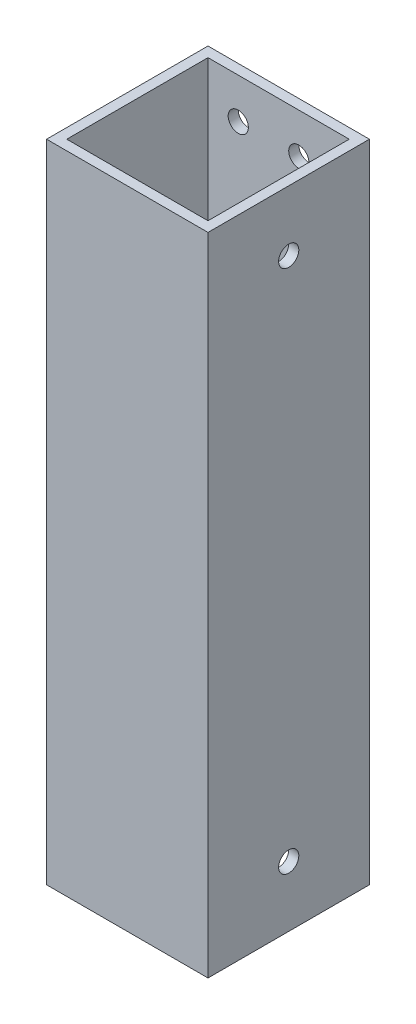
ISO-10303-21;
HEADER;
FILE_DESCRIPTION(('STEP AP214'),'2;1');
FILE_NAME('part.step','',(''),(''),'','','');
FILE_SCHEMA(('AUTOMOTIVE_DESIGN { 1 0 10303 214 1 1 1 1 }'));
ENDSEC;
DATA;
#1=APPLICATION_CONTEXT('core data for automotive mechanical design processes');
#2=APPLICATION_PROTOCOL_DEFINITION('international standard','automotive_design',2000,#1);
#3=PRODUCT_CONTEXT('',#1,'mechanical');
#4=PRODUCT('Part','Part','',(#3));
#5=PRODUCT_RELATED_PRODUCT_CATEGORY('part','',(#4));
#6=PRODUCT_DEFINITION_FORMATION('','',#4);
#7=PRODUCT_DEFINITION_CONTEXT('part definition',#1,'design');
#8=PRODUCT_DEFINITION('design','',#6,#7);
#9=PRODUCT_DEFINITION_SHAPE('','',#8);
#10=(LENGTH_UNIT() NAMED_UNIT(*) SI_UNIT(.MILLI.,.METRE.));
#11=(NAMED_UNIT(*) PLANE_ANGLE_UNIT() SI_UNIT($,.RADIAN.));
#12=(NAMED_UNIT(*) SI_UNIT($,.STERADIAN.) SOLID_ANGLE_UNIT());
#13=UNCERTAINTY_MEASURE_WITH_UNIT(LENGTH_MEASURE(1.E-05),#10,'distance_accuracy_value','');
#14=(GEOMETRIC_REPRESENTATION_CONTEXT(3) GLOBAL_UNCERTAINTY_ASSIGNED_CONTEXT((#13)) GLOBAL_UNIT_ASSIGNED_CONTEXT((#10,
#11,#12)) REPRESENTATION_CONTEXT('',''));
#15=CARTESIAN_POINT('',(0.,0.,0.));
#16=DIRECTION('',(0.,0.,1.));
#17=DIRECTION('',(1.,0.,0.));
#18=AXIS2_PLACEMENT_3D('',#15,#16,#17);
#19=CARTESIAN_POINT('',(0.,203.2,0.));
#20=DIRECTION('',(0.,-1.,0.));
#21=DIRECTION('',(0.,0.,-1.));
#22=AXIS2_PLACEMENT_3D('',#19,#20,#21);
#23=PLANE('',#22);
#24=DIRECTION('',(0.,0.,1.));
#25=VECTOR('',#24,1.);
#26=CARTESIAN_POINT('',(0.,203.2,0.));
#27=LINE('',#26,#25);
#28=CARTESIAN_POINT('',(0.,203.2,-50.8));
#29=VERTEX_POINT('',#28);
#30=CARTESIAN_POINT('',(0.,203.2,0.));
#31=VERTEX_POINT('',#30);
#32=EDGE_CURVE('E138',#29,#31,#27,.T.);
#33=ORIENTED_EDGE('',*,*,#32,.T.);
#34=DIRECTION('',(1.,0.,0.));
#35=VECTOR('',#34,1.);
#36=CARTESIAN_POINT('',(0.,203.2,0.));
#37=LINE('',#36,#35);
#38=CARTESIAN_POINT('',(50.8,203.2,0.));
#39=VERTEX_POINT('',#38);
#40=EDGE_CURVE('E141',#31,#39,#37,.T.);
#41=ORIENTED_EDGE('',*,*,#40,.T.);
#42=DIRECTION('',(0.,0.,-1.));
#43=VECTOR('',#42,1.);
#44=CARTESIAN_POINT('',(50.8,203.2,0.));
#45=LINE('',#44,#43);
#46=CARTESIAN_POINT('',(50.8,203.2,-50.8));
#47=VERTEX_POINT('',#46);
#48=EDGE_CURVE('E144',#39,#47,#45,.T.);
#49=ORIENTED_EDGE('',*,*,#48,.T.);
#50=DIRECTION('',(-1.,0.,0.));
#51=VECTOR('',#50,1.);
#52=CARTESIAN_POINT('',(0.,203.2,-50.8));
#53=LINE('',#52,#51);
#54=EDGE_CURVE('E146',#47,#29,#53,.T.);
#55=ORIENTED_EDGE('',*,*,#54,.T.);
#56=EDGE_LOOP('',(#33,#41,#49,#55));
#57=FACE_BOUND('',#56,.T.);
#58=DIRECTION('',(0.,0.,1.));
#59=VECTOR('',#58,1.);
#60=CARTESIAN_POINT('',(3.175,203.2,-3.175));
#61=LINE('',#60,#59);
#62=CARTESIAN_POINT('',(3.175,203.2,-47.625));
#63=VERTEX_POINT('',#62);
#64=CARTESIAN_POINT('',(3.175,203.2,-3.175));
#65=VERTEX_POINT('',#64);
#66=EDGE_CURVE('E100',#63,#65,#61,.T.);
#67=ORIENTED_EDGE('',*,*,#66,.F.);
#68=DIRECTION('',(-1.,0.,0.));
#69=VECTOR('',#68,1.);
#70=CARTESIAN_POINT('',(3.175,203.2,-47.625));
#71=LINE('',#70,#69);
#72=CARTESIAN_POINT('',(47.625,203.2,-47.625));
#73=VERTEX_POINT('',#72);
#74=EDGE_CURVE('E122',#73,#63,#71,.T.);
#75=ORIENTED_EDGE('',*,*,#74,.F.);
#76=DIRECTION('',(0.,0.,-1.));
#77=VECTOR('',#76,1.);
#78=CARTESIAN_POINT('',(47.625,203.2,-3.175));
#79=LINE('',#78,#77);
#80=CARTESIAN_POINT('',(47.625,203.2,-3.175));
#81=VERTEX_POINT('',#80);
#82=EDGE_CURVE('E120',#81,#73,#79,.T.);
#83=ORIENTED_EDGE('',*,*,#82,.F.);
#84=DIRECTION('',(1.,0.,0.));
#85=VECTOR('',#84,1.);
#86=CARTESIAN_POINT('',(3.175,203.2,-3.175));
#87=LINE('',#86,#85);
#88=EDGE_CURVE('E108',#65,#81,#87,.T.);
#89=ORIENTED_EDGE('',*,*,#88,.F.);
#90=EDGE_LOOP('',(#67,#75,#83,#89));
#91=FACE_BOUND('',#90,.T.);
#92=ADVANCED_FACE('F33',(#57,#91),#23,.F.);
#93=CARTESIAN_POINT('',(0.,0.,0.));
#94=DIRECTION('',(0.,-1.,0.));
#95=DIRECTION('',(0.,0.,-1.));
#96=AXIS2_PLACEMENT_3D('',#93,#94,#95);
#97=PLANE('',#96);
#98=DIRECTION('',(0.,0.,1.));
#99=VECTOR('',#98,1.);
#100=CARTESIAN_POINT('',(0.,0.,0.));
#101=LINE('',#100,#99);
#102=CARTESIAN_POINT('',(0.,0.,-50.8));
#103=VERTEX_POINT('',#102);
#104=CARTESIAN_POINT('',(0.,0.,0.));
#105=VERTEX_POINT('',#104);
#106=EDGE_CURVE('E116',#103,#105,#101,.T.);
#107=ORIENTED_EDGE('',*,*,#106,.F.);
#108=DIRECTION('',(-1.,0.,0.));
#109=VECTOR('',#108,1.);
#110=CARTESIAN_POINT('',(0.,0.,-50.8));
#111=LINE('',#110,#109);
#112=CARTESIAN_POINT('',(50.8,0.,-50.8));
#113=VERTEX_POINT('',#112);
#114=EDGE_CURVE('E142',#113,#103,#111,.T.);
#115=ORIENTED_EDGE('',*,*,#114,.F.);
#116=DIRECTION('',(0.,0.,-1.));
#117=VECTOR('',#116,1.);
#118=CARTESIAN_POINT('',(50.8,0.,0.));
#119=LINE('',#118,#117);
#120=CARTESIAN_POINT('',(50.8,0.,0.));
#121=VERTEX_POINT('',#120);
#122=EDGE_CURVE('E153',#121,#113,#119,.T.);
#123=ORIENTED_EDGE('',*,*,#122,.F.);
#124=DIRECTION('',(1.,0.,0.));
#125=VECTOR('',#124,1.);
#126=CARTESIAN_POINT('',(0.,0.,0.));
#127=LINE('',#126,#125);
#128=EDGE_CURVE('E151',#105,#121,#127,.T.);
#129=ORIENTED_EDGE('',*,*,#128,.F.);
#130=EDGE_LOOP('',(#107,#115,#123,#129));
#131=FACE_BOUND('',#130,.T.);
#132=DIRECTION('',(-1.,0.,0.));
#133=VECTOR('',#132,1.);
#134=CARTESIAN_POINT('',(3.175,0.,-47.625));
#135=LINE('',#134,#133);
#136=CARTESIAN_POINT('',(47.625,0.,-47.625));
#137=VERTEX_POINT('',#136);
#138=CARTESIAN_POINT('',(3.175,0.,-47.625));
#139=VERTEX_POINT('',#138);
#140=EDGE_CURVE('E109',#137,#139,#135,.T.);
#141=ORIENTED_EDGE('',*,*,#140,.T.);
#142=DIRECTION('',(0.,0.,1.));
#143=VECTOR('',#142,1.);
#144=CARTESIAN_POINT('',(3.175,0.,-3.175));
#145=LINE('',#144,#143);
#146=CARTESIAN_POINT('',(3.175,0.,-3.175));
#147=VERTEX_POINT('',#146);
#148=EDGE_CURVE('E58',#139,#147,#145,.T.);
#149=ORIENTED_EDGE('',*,*,#148,.T.);
#150=DIRECTION('',(1.,0.,0.));
#151=VECTOR('',#150,1.);
#152=CARTESIAN_POINT('',(3.175,0.,-3.175));
#153=LINE('',#152,#151);
#154=CARTESIAN_POINT('',(47.625,0.,-3.175));
#155=VERTEX_POINT('',#154);
#156=EDGE_CURVE('E115',#147,#155,#153,.T.);
#157=ORIENTED_EDGE('',*,*,#156,.T.);
#158=DIRECTION('',(0.,0.,-1.));
#159=VECTOR('',#158,1.);
#160=CARTESIAN_POINT('',(47.625,0.,-3.175));
#161=LINE('',#160,#159);
#162=EDGE_CURVE('E130',#155,#137,#161,.T.);
#163=ORIENTED_EDGE('',*,*,#162,.T.);
#164=EDGE_LOOP('',(#141,#149,#157,#163));
#165=FACE_BOUND('',#164,.T.);
#166=ADVANCED_FACE('F216',(#131,#165),#97,.T.);
#167=CARTESIAN_POINT('',(0.,203.2,0.));
#168=DIRECTION('',(1.,0.,0.));
#169=DIRECTION('',(0.,0.,-1.));
#170=AXIS2_PLACEMENT_3D('',#167,#168,#169);
#171=PLANE('',#170);
#172=ORIENTED_EDGE('',*,*,#106,.T.);
#173=DIRECTION('',(0.,-1.,0.));
#174=VECTOR('',#173,1.);
#175=CARTESIAN_POINT('',(0.,203.2,0.));
#176=LINE('',#175,#174);
#177=EDGE_CURVE('E11',#31,#105,#176,.T.);
#178=ORIENTED_EDGE('',*,*,#177,.F.);
#179=ORIENTED_EDGE('',*,*,#32,.F.);
#180=DIRECTION('',(0.,-1.,0.));
#181=VECTOR('',#180,1.);
#182=CARTESIAN_POINT('',(0.,203.2,-50.8));
#183=LINE('',#182,#181);
#184=EDGE_CURVE('E148',#29,#103,#183,.T.);
#185=ORIENTED_EDGE('',*,*,#184,.T.);
#186=EDGE_LOOP('',(#172,#178,#179,#185));
#187=FACE_BOUND('',#186,.T.);
#188=ADVANCED_FACE('F35',(#187),#171,.F.);
#189=CARTESIAN_POINT('',(0.,203.2,0.));
#190=DIRECTION('',(0.,0.,-1.));
#191=DIRECTION('',(-1.,0.,0.));
#192=AXIS2_PLACEMENT_3D('',#189,#190,#191);
#193=PLANE('',#192);
#194=ORIENTED_EDGE('',*,*,#128,.T.);
#195=DIRECTION('',(0.,-1.,0.));
#196=VECTOR('',#195,1.);
#197=CARTESIAN_POINT('',(50.8,203.2,0.));
#198=LINE('',#197,#196);
#199=EDGE_CURVE('E42',#39,#121,#198,.T.);
#200=ORIENTED_EDGE('',*,*,#199,.F.);
#201=ORIENTED_EDGE('',*,*,#40,.F.);
#202=ORIENTED_EDGE('',*,*,#177,.T.);
#203=EDGE_LOOP('',(#194,#200,#201,#202));
#204=FACE_BOUND('',#203,.T.);
#205=ADVANCED_FACE('F220',(#204),#193,.F.);
#206=CARTESIAN_POINT('',(50.8,203.2,0.));
#207=DIRECTION('',(-1.,0.,0.));
#208=DIRECTION('',(0.,0.,1.));
#209=AXIS2_PLACEMENT_3D('',#206,#207,#208);
#210=PLANE('',#209);
#211=CARTESIAN_POINT('',(50.8,19.05,-25.4));
#212=DIRECTION('',(1.,0.,0.));
#213=DIRECTION('',(0.,0.,-1.));
#214=AXIS2_PLACEMENT_3D('',#211,#212,#213);
#215=CIRCLE('',#214,3.175);
#216=CARTESIAN_POINT('',(50.8,19.05,-28.575));
#217=VERTEX_POINT('',#216);
#218=EDGE_CURVE('E189',#217,#217,#215,.T.);
#219=ORIENTED_EDGE('',*,*,#218,.F.);
#220=EDGE_LOOP('',(#219));
#221=FACE_BOUND('',#220,.T.);
#222=CARTESIAN_POINT('',(50.8,184.15,-25.4));
#223=DIRECTION('',(1.,0.,0.));
#224=DIRECTION('',(0.,0.,-1.));
#225=AXIS2_PLACEMENT_3D('',#222,#223,#224);
#226=CIRCLE('',#225,3.175);
#227=CARTESIAN_POINT('',(50.8,184.15,-28.575));
#228=VERTEX_POINT('',#227);
#229=EDGE_CURVE('E179',#228,#228,#226,.T.);
#230=ORIENTED_EDGE('',*,*,#229,.F.);
#231=EDGE_LOOP('',(#230));
#232=FACE_BOUND('',#231,.T.);
#233=ORIENTED_EDGE('',*,*,#122,.T.);
#234=DIRECTION('',(0.,-1.,0.));
#235=VECTOR('',#234,1.);
#236=CARTESIAN_POINT('',(50.8,203.2,-50.8));
#237=LINE('',#236,#235);
#238=EDGE_CURVE('E158',#47,#113,#237,.T.);
#239=ORIENTED_EDGE('',*,*,#238,.F.);
#240=ORIENTED_EDGE('',*,*,#48,.F.);
#241=ORIENTED_EDGE('',*,*,#199,.T.);
#242=EDGE_LOOP('',(#233,#239,#240,#241));
#243=FACE_BOUND('',#242,.T.);
#244=ADVANCED_FACE('F203',(#221,#232,#243),#210,.F.);
#245=CARTESIAN_POINT('',(0.,203.2,-50.8));
#246=DIRECTION('',(0.,0.,1.));
#247=DIRECTION('',(1.,0.,0.));
#248=AXIS2_PLACEMENT_3D('',#245,#246,#247);
#249=PLANE('',#248);
#250=CARTESIAN_POINT('',(12.7,12.7,-50.8));
#251=DIRECTION('',(0.,0.,-1.));
#252=DIRECTION('',(-1.,0.,0.));
#253=AXIS2_PLACEMENT_3D('',#250,#251,#252);
#254=CIRCLE('',#253,3.175);
#255=CARTESIAN_POINT('',(9.52500000000001,12.7,-50.8));
#256=VERTEX_POINT('',#255);
#257=EDGE_CURVE('E176',#256,#256,#254,.T.);
#258=ORIENTED_EDGE('',*,*,#257,.F.);
#259=EDGE_LOOP('',(#258));
#260=FACE_BOUND('',#259,.T.);
#261=CARTESIAN_POINT('',(31.75,12.7,-50.8));
#262=DIRECTION('',(0.,0.,-1.));
#263=DIRECTION('',(-1.,0.,0.));
#264=AXIS2_PLACEMENT_3D('',#261,#262,#263);
#265=CIRCLE('',#264,3.175);
#266=CARTESIAN_POINT('',(28.575,12.7,-50.8));
#267=VERTEX_POINT('',#266);
#268=EDGE_CURVE('E173',#267,#267,#265,.T.);
#269=ORIENTED_EDGE('',*,*,#268,.F.);
#270=EDGE_LOOP('',(#269));
#271=FACE_BOUND('',#270,.T.);
#272=CARTESIAN_POINT('',(31.75,190.5,-50.8));
#273=DIRECTION('',(0.,0.,-1.));
#274=DIRECTION('',(-1.,0.,0.));
#275=AXIS2_PLACEMENT_3D('',#272,#273,#274);
#276=CIRCLE('',#275,3.175);
#277=CARTESIAN_POINT('',(28.575,190.5,-50.8));
#278=VERTEX_POINT('',#277);
#279=EDGE_CURVE('E169',#278,#278,#276,.T.);
#280=ORIENTED_EDGE('',*,*,#279,.F.);
#281=EDGE_LOOP('',(#280));
#282=FACE_BOUND('',#281,.T.);
#283=CARTESIAN_POINT('',(12.7,190.5,-50.8));
#284=DIRECTION('',(0.,0.,-1.));
#285=DIRECTION('',(-1.,0.,0.));
#286=AXIS2_PLACEMENT_3D('',#283,#284,#285);
#287=CIRCLE('',#286,3.175);
#288=CARTESIAN_POINT('',(9.525,190.5,-50.8));
#289=VERTEX_POINT('',#288);
#290=EDGE_CURVE('E165',#289,#289,#287,.T.);
#291=ORIENTED_EDGE('',*,*,#290,.F.);
#292=EDGE_LOOP('',(#291));
#293=FACE_BOUND('',#292,.T.);
#294=ORIENTED_EDGE('',*,*,#114,.T.);
#295=ORIENTED_EDGE('',*,*,#184,.F.);
#296=ORIENTED_EDGE('',*,*,#54,.F.);
#297=ORIENTED_EDGE('',*,*,#238,.T.);
#298=EDGE_LOOP('',(#294,#295,#296,#297));
#299=FACE_BOUND('',#298,.T.);
#300=ADVANCED_FACE('F200',(#260,#271,#282,#293,#299),#249,.F.);
#301=CARTESIAN_POINT('',(3.175,203.2,-3.175));
#302=DIRECTION('',(1.,0.,0.));
#303=DIRECTION('',(0.,0.,-1.));
#304=AXIS2_PLACEMENT_3D('',#301,#302,#303);
#305=PLANE('',#304);
#306=ORIENTED_EDGE('',*,*,#148,.F.);
#307=DIRECTION('',(0.,-1.,0.));
#308=VECTOR('',#307,1.);
#309=CARTESIAN_POINT('',(3.175,203.2,-47.625));
#310=LINE('',#309,#308);
#311=EDGE_CURVE('E104',#63,#139,#310,.T.);
#312=ORIENTED_EDGE('',*,*,#311,.F.);
#313=ORIENTED_EDGE('',*,*,#66,.T.);
#314=DIRECTION('',(0.,-1.,0.));
#315=VECTOR('',#314,1.);
#316=CARTESIAN_POINT('',(3.175,203.2,-3.175));
#317=LINE('',#316,#315);
#318=EDGE_CURVE('E103',#65,#147,#317,.T.);
#319=ORIENTED_EDGE('',*,*,#318,.T.);
#320=EDGE_LOOP('',(#306,#312,#313,#319));
#321=FACE_BOUND('',#320,.T.);
#322=ADVANCED_FACE('F102',(#321),#305,.T.);
#323=CARTESIAN_POINT('',(3.175,203.2,-3.175));
#324=DIRECTION('',(0.,0.,-1.));
#325=DIRECTION('',(-1.,0.,0.));
#326=AXIS2_PLACEMENT_3D('',#323,#324,#325);
#327=PLANE('',#326);
#328=ORIENTED_EDGE('',*,*,#156,.F.);
#329=ORIENTED_EDGE('',*,*,#318,.F.);
#330=ORIENTED_EDGE('',*,*,#88,.T.);
#331=DIRECTION('',(0.,-1.,0.));
#332=VECTOR('',#331,1.);
#333=CARTESIAN_POINT('',(47.625,203.2,-3.175));
#334=LINE('',#333,#332);
#335=EDGE_CURVE('E117',#81,#155,#334,.T.);
#336=ORIENTED_EDGE('',*,*,#335,.T.);
#337=EDGE_LOOP('',(#328,#329,#330,#336));
#338=FACE_BOUND('',#337,.T.);
#339=ADVANCED_FACE('F112',(#338),#327,.T.);
#340=CARTESIAN_POINT('',(47.625,203.2,-3.175));
#341=DIRECTION('',(-1.,0.,0.));
#342=DIRECTION('',(0.,0.,1.));
#343=AXIS2_PLACEMENT_3D('',#340,#341,#342);
#344=PLANE('',#343);
#345=CARTESIAN_POINT('',(47.625,19.05,-25.4));
#346=DIRECTION('',(-1.,0.,0.));
#347=DIRECTION('',(0.,0.,1.));
#348=AXIS2_PLACEMENT_3D('',#345,#346,#347);
#349=CIRCLE('',#348,3.175);
#350=CARTESIAN_POINT('',(47.625,19.05,-22.225));
#351=VERTEX_POINT('',#350);
#352=EDGE_CURVE('E37',#351,#351,#349,.T.);
#353=ORIENTED_EDGE('',*,*,#352,.F.);
#354=EDGE_LOOP('',(#353));
#355=FACE_BOUND('',#354,.T.);
#356=CARTESIAN_POINT('',(47.625,184.15,-25.4));
#357=DIRECTION('',(-1.,0.,0.));
#358=DIRECTION('',(0.,0.,1.));
#359=AXIS2_PLACEMENT_3D('',#356,#357,#358);
#360=CIRCLE('',#359,3.175);
#361=CARTESIAN_POINT('',(47.625,184.15,-22.225));
#362=VERTEX_POINT('',#361);
#363=EDGE_CURVE('E177',#362,#362,#360,.T.);
#364=ORIENTED_EDGE('',*,*,#363,.F.);
#365=EDGE_LOOP('',(#364));
#366=FACE_BOUND('',#365,.T.);
#367=ORIENTED_EDGE('',*,*,#162,.F.);
#368=ORIENTED_EDGE('',*,*,#335,.F.);
#369=ORIENTED_EDGE('',*,*,#82,.T.);
#370=DIRECTION('',(0.,-1.,0.));
#371=VECTOR('',#370,1.);
#372=CARTESIAN_POINT('',(47.625,203.2,-47.625));
#373=LINE('',#372,#371);
#374=EDGE_CURVE('E50',#73,#137,#373,.T.);
#375=ORIENTED_EDGE('',*,*,#374,.T.);
#376=EDGE_LOOP('',(#367,#368,#369,#375));
#377=FACE_BOUND('',#376,.T.);
#378=ADVANCED_FACE('F245',(#355,#366,#377),#344,.T.);
#379=CARTESIAN_POINT('',(3.175,203.2,-47.625));
#380=DIRECTION('',(0.,0.,1.));
#381=DIRECTION('',(1.,0.,0.));
#382=AXIS2_PLACEMENT_3D('',#379,#380,#381);
#383=PLANE('',#382);
#384=CARTESIAN_POINT('',(12.7,12.7,-47.625));
#385=DIRECTION('',(0.,0.,1.));
#386=DIRECTION('',(1.,0.,0.));
#387=AXIS2_PLACEMENT_3D('',#384,#385,#386);
#388=CIRCLE('',#387,3.175);
#389=CARTESIAN_POINT('',(15.875,12.7,-47.625));
#390=VERTEX_POINT('',#389);
#391=EDGE_CURVE('E174',#390,#390,#388,.T.);
#392=ORIENTED_EDGE('',*,*,#391,.F.);
#393=EDGE_LOOP('',(#392));
#394=FACE_BOUND('',#393,.T.);
#395=CARTESIAN_POINT('',(31.75,12.7,-47.625));
#396=DIRECTION('',(0.,0.,1.));
#397=DIRECTION('',(1.,0.,0.));
#398=AXIS2_PLACEMENT_3D('',#395,#396,#397);
#399=CIRCLE('',#398,3.175);
#400=CARTESIAN_POINT('',(34.925,12.7,-47.625));
#401=VERTEX_POINT('',#400);
#402=EDGE_CURVE('E170',#401,#401,#399,.T.);
#403=ORIENTED_EDGE('',*,*,#402,.F.);
#404=EDGE_LOOP('',(#403));
#405=FACE_BOUND('',#404,.T.);
#406=CARTESIAN_POINT('',(31.75,190.5,-47.625));
#407=DIRECTION('',(0.,0.,1.));
#408=DIRECTION('',(1.,0.,0.));
#409=AXIS2_PLACEMENT_3D('',#406,#407,#408);
#410=CIRCLE('',#409,3.175);
#411=CARTESIAN_POINT('',(34.925,190.5,-47.625));
#412=VERTEX_POINT('',#411);
#413=EDGE_CURVE('E166',#412,#412,#410,.T.);
#414=ORIENTED_EDGE('',*,*,#413,.F.);
#415=EDGE_LOOP('',(#414));
#416=FACE_BOUND('',#415,.T.);
#417=CARTESIAN_POINT('',(12.7,190.5,-47.625));
#418=DIRECTION('',(0.,0.,1.));
#419=DIRECTION('',(1.,0.,0.));
#420=AXIS2_PLACEMENT_3D('',#417,#418,#419);
#421=CIRCLE('',#420,3.175);
#422=CARTESIAN_POINT('',(15.875,190.5,-47.625));
#423=VERTEX_POINT('',#422);
#424=EDGE_CURVE('E128',#423,#423,#421,.T.);
#425=ORIENTED_EDGE('',*,*,#424,.F.);
#426=EDGE_LOOP('',(#425));
#427=FACE_BOUND('',#426,.T.);
#428=ORIENTED_EDGE('',*,*,#140,.F.);
#429=ORIENTED_EDGE('',*,*,#374,.F.);
#430=ORIENTED_EDGE('',*,*,#74,.T.);
#431=ORIENTED_EDGE('',*,*,#311,.T.);
#432=EDGE_LOOP('',(#428,#429,#430,#431));
#433=FACE_BOUND('',#432,.T.);
#434=ADVANCED_FACE('F247',(#394,#405,#416,#427,#433),#383,.T.);
#435=CARTESIAN_POINT('',(12.7,190.5,-26.162));
#436=DIRECTION('',(0.,0.,-1.));
#437=DIRECTION('',(-1.,0.,0.));
#438=AXIS2_PLACEMENT_3D('',#435,#436,#437);
#439=CYLINDRICAL_SURFACE('',#438,3.175);
#440=ORIENTED_EDGE('',*,*,#424,.T.);
#441=EDGE_LOOP('',(#440));
#442=FACE_BOUND('',#441,.T.);
#443=ORIENTED_EDGE('',*,*,#290,.T.);
#444=EDGE_LOOP('',(#443));
#445=FACE_BOUND('',#444,.T.);
#446=ADVANCED_FACE('F198',(#442,#445),#439,.F.);
#447=CARTESIAN_POINT('',(31.75,190.5,-26.162));
#448=DIRECTION('',(0.,0.,-1.));
#449=DIRECTION('',(-1.,0.,0.));
#450=AXIS2_PLACEMENT_3D('',#447,#448,#449);
#451=CYLINDRICAL_SURFACE('',#450,3.175);
#452=ORIENTED_EDGE('',*,*,#413,.T.);
#453=EDGE_LOOP('',(#452));
#454=FACE_BOUND('',#453,.T.);
#455=ORIENTED_EDGE('',*,*,#279,.T.);
#456=EDGE_LOOP('',(#455));
#457=FACE_BOUND('',#456,.T.);
#458=ADVANCED_FACE('F254',(#454,#457),#451,.F.);
#459=CARTESIAN_POINT('',(31.75,12.7,-26.162));
#460=DIRECTION('',(0.,0.,-1.));
#461=DIRECTION('',(-1.,0.,0.));
#462=AXIS2_PLACEMENT_3D('',#459,#460,#461);
#463=CYLINDRICAL_SURFACE('',#462,3.175);
#464=ORIENTED_EDGE('',*,*,#402,.T.);
#465=EDGE_LOOP('',(#464));
#466=FACE_BOUND('',#465,.T.);
#467=ORIENTED_EDGE('',*,*,#268,.T.);
#468=EDGE_LOOP('',(#467));
#469=FACE_BOUND('',#468,.T.);
#470=ADVANCED_FACE('F258',(#466,#469),#463,.F.);
#471=CARTESIAN_POINT('',(12.7,12.7,-26.162));
#472=DIRECTION('',(0.,0.,-1.));
#473=DIRECTION('',(-1.,0.,0.));
#474=AXIS2_PLACEMENT_3D('',#471,#472,#473);
#475=CYLINDRICAL_SURFACE('',#474,3.175);
#476=ORIENTED_EDGE('',*,*,#391,.T.);
#477=EDGE_LOOP('',(#476));
#478=FACE_BOUND('',#477,.T.);
#479=ORIENTED_EDGE('',*,*,#257,.T.);
#480=EDGE_LOOP('',(#479));
#481=FACE_BOUND('',#480,.T.);
#482=ADVANCED_FACE('F262',(#478,#481),#475,.F.);
#483=CARTESIAN_POINT('',(26.162,184.15,-25.4));
#484=DIRECTION('',(1.,0.,0.));
#485=DIRECTION('',(0.,0.,-1.));
#486=AXIS2_PLACEMENT_3D('',#483,#484,#485);
#487=CYLINDRICAL_SURFACE('',#486,3.175);
#488=ORIENTED_EDGE('',*,*,#363,.T.);
#489=EDGE_LOOP('',(#488));
#490=FACE_BOUND('',#489,.T.);
#491=ORIENTED_EDGE('',*,*,#229,.T.);
#492=EDGE_LOOP('',(#491));
#493=FACE_BOUND('',#492,.T.);
#494=ADVANCED_FACE('F266',(#490,#493),#487,.F.);
#495=CARTESIAN_POINT('',(26.162,19.05,-25.4));
#496=DIRECTION('',(1.,0.,0.));
#497=DIRECTION('',(0.,0.,-1.));
#498=AXIS2_PLACEMENT_3D('',#495,#496,#497);
#499=CYLINDRICAL_SURFACE('',#498,3.175);
#500=ORIENTED_EDGE('',*,*,#352,.T.);
#501=EDGE_LOOP('',(#500));
#502=FACE_BOUND('',#501,.T.);
#503=ORIENTED_EDGE('',*,*,#218,.T.);
#504=EDGE_LOOP('',(#503));
#505=FACE_BOUND('',#504,.T.);
#506=ADVANCED_FACE('F270',(#502,#505),#499,.F.);
#507=CLOSED_SHELL('',(#92,#166,#188,#205,#244,#300,#322,#339,#378,#434,#446,#458,#470,#482,#494,#506));
#508=MANIFOLD_SOLID_BREP('B2',#507);
#509=ADVANCED_BREP_SHAPE_REPRESENTATION('',(#18,#508),#14);
#510=SHAPE_DEFINITION_REPRESENTATION(#9,#509);
ENDSEC;
END-ISO-10303-21;
